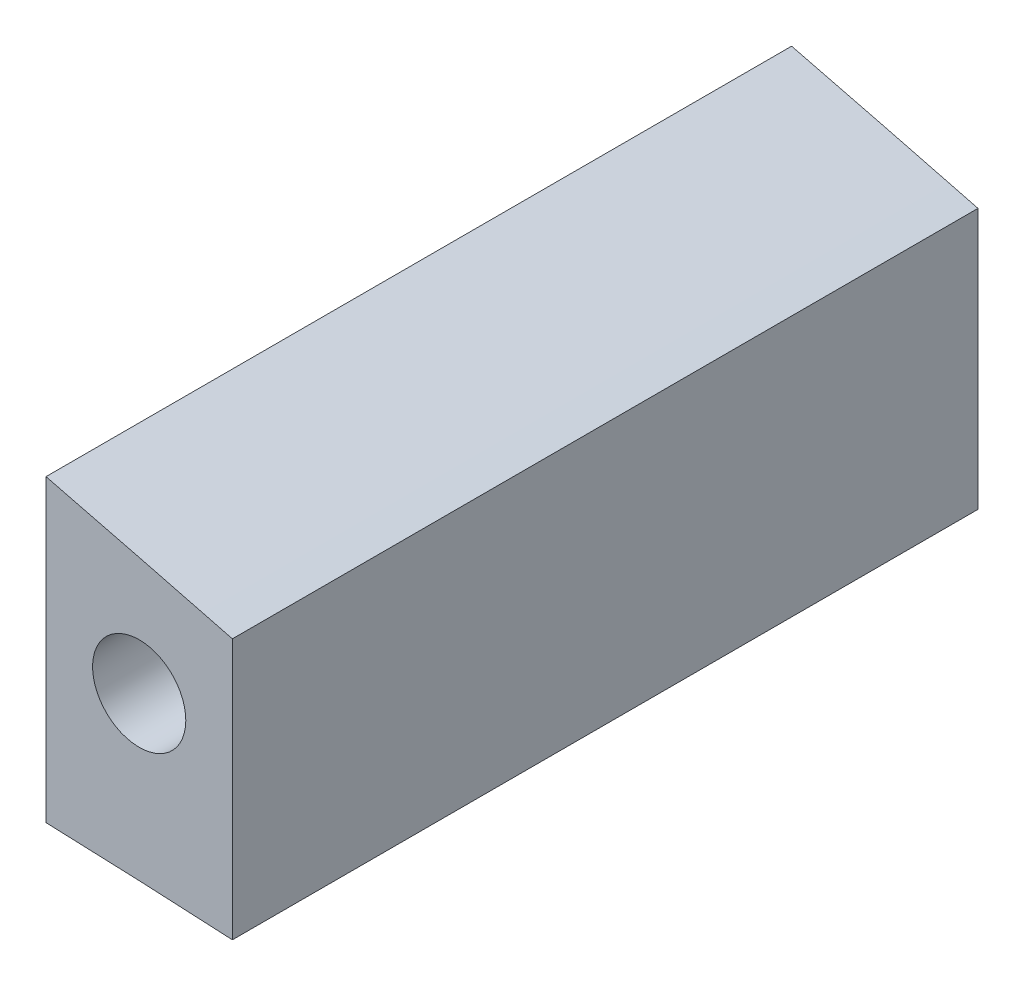
ISO-10303-21;
HEADER;
FILE_DESCRIPTION(('STEP AP214'),'2;1');
FILE_NAME('part.step','',(''),(''),'','','');
FILE_SCHEMA(('AUTOMOTIVE_DESIGN { 1 0 10303 214 1 1 1 1 }'));
ENDSEC;
DATA;
#1=APPLICATION_CONTEXT('core data for automotive mechanical design processes');
#2=APPLICATION_PROTOCOL_DEFINITION('international standard','automotive_design',2000,#1);
#3=PRODUCT_CONTEXT('',#1,'mechanical');
#4=PRODUCT('Part','Part','',(#3));
#5=PRODUCT_RELATED_PRODUCT_CATEGORY('part','',(#4));
#6=PRODUCT_DEFINITION_FORMATION('','',#4);
#7=PRODUCT_DEFINITION_CONTEXT('part definition',#1,'design');
#8=PRODUCT_DEFINITION('design','',#6,#7);
#9=PRODUCT_DEFINITION_SHAPE('','',#8);
#10=(LENGTH_UNIT() NAMED_UNIT(*) SI_UNIT(.MILLI.,.METRE.));
#11=(NAMED_UNIT(*) PLANE_ANGLE_UNIT() SI_UNIT($,.RADIAN.));
#12=(NAMED_UNIT(*) SI_UNIT($,.STERADIAN.) SOLID_ANGLE_UNIT());
#13=UNCERTAINTY_MEASURE_WITH_UNIT(LENGTH_MEASURE(1.E-05),#10,'distance_accuracy_value','');
#14=(GEOMETRIC_REPRESENTATION_CONTEXT(3) GLOBAL_UNCERTAINTY_ASSIGNED_CONTEXT((#13)) GLOBAL_UNIT_ASSIGNED_CONTEXT((#10,
#11,#12)) REPRESENTATION_CONTEXT('',''));
#15=CARTESIAN_POINT('',(0.,0.,0.));
#16=DIRECTION('',(0.,0.,1.));
#17=DIRECTION('',(1.,0.,0.));
#18=AXIS2_PLACEMENT_3D('',#15,#16,#17);
#19=CARTESIAN_POINT('',(0.000560351162113587,0.000130087070423624,50.8));
#20=CARTESIAN_POINT('',(1.23071418869678,-6.92407609127206,50.8));
#21=CARTESIAN_POINT('',(15.3166033306834,-6.18906584099094,50.8));
#22=CARTESIAN_POINT('',(36.4546728163185,-6.09849990105009,50.8));
#23=CARTESIAN_POINT('',(66.5061971849192,-0.586669106973501,50.8));
#24=CARTESIAN_POINT('',(110.497331171581,6.18149522271792,50.8));
#25=CARTESIAN_POINT('',(157.718638091679,9.03065014873911,50.8));
#26=CARTESIAN_POINT('',(205.10142463584,8.83808028186313,50.8));
#27=CARTESIAN_POINT('',(235.858814759408,7.87030619247826,50.8));
#28=CARTESIAN_POINT('',(260.846344817159,5.42741339404395,50.8));
#29=CARTESIAN_POINT('',(276.264022989737,4.51435670375389,50.8));
#30=CARTESIAN_POINT('',(293.989507544058,2.09398731346533,50.8));
#31=CARTESIAN_POINT('',(303.956832564589,1.47095520994628,50.8));
#32=CARTESIAN_POINT('',(309.846313894505,0.000130087070423666,50.8));
#33=B_SPLINE_CURVE_WITH_KNOTS('',3,(#19,#20,#21,#22,#23,#24,#25,#26,#27,#28,#29,#30,#31,#32),
.UNSPECIFIED.,.F.,.F.,(4,1,1,1,1,1,1,1,1,1,1,4),(0.,0.0569078595717698,0.106482711504673,
0.214488052979465,0.341297688349143,0.535095665520157,0.664680853556909,0.794660698192775,
0.828978881532905,0.904725108725214,0.942212919019968,1.),.UNSPECIFIED.);
#34=DIRECTION('',(0.,0.,-1.));
#35=VECTOR('',#34,1.);
#36=SURFACE_OF_LINEAR_EXTRUSION('',#33,#35);
#37=CARTESIAN_POINT('',(220.946313894505,8.25519881438191,50.8));
#38=VERTEX_POINT('',#37);
#39=CARTESIAN_POINT('',(233.646313894505,7.69052977146896,50.8));
#40=VERTEX_POINT('',#39);
#41=EDGE_CURVE('E92',#38,#40,#33,.T.);
#42=ORIENTED_EDGE('',*,*,#41,.F.);
#43=DIRECTION('',(0.,0.,-1.));
#44=VECTOR('',#43,1.);
#45=CARTESIAN_POINT('',(220.946313894505,8.25519881439546,50.8));
#46=LINE('',#45,#44);
#47=CARTESIAN_POINT('',(220.946313894505,8.2551988143819,0.));
#48=VERTEX_POINT('',#47);
#49=EDGE_CURVE('E79',#38,#48,#46,.T.);
#50=ORIENTED_EDGE('',*,*,#49,.T.);
#51=CARTESIAN_POINT('',(0.000560351162113587,0.000130087070423624,0.));
#52=CARTESIAN_POINT('',(1.23071418869678,-6.92407609127206,0.));
#53=CARTESIAN_POINT('',(15.3166033306834,-6.18906584099094,0.));
#54=CARTESIAN_POINT('',(36.4546728163185,-6.09849990105009,0.));
#55=CARTESIAN_POINT('',(66.5061971849192,-0.586669106973501,0.));
#56=CARTESIAN_POINT('',(110.497331171581,6.18149522271792,0.));
#57=CARTESIAN_POINT('',(157.718638091679,9.03065014873911,0.));
#58=CARTESIAN_POINT('',(205.10142463584,8.83808028186313,0.));
#59=CARTESIAN_POINT('',(235.858814759408,7.87030619247826,0.));
#60=CARTESIAN_POINT('',(260.846344817159,5.42741339404395,0.));
#61=CARTESIAN_POINT('',(276.264022989737,4.51435670375389,0.));
#62=CARTESIAN_POINT('',(293.989507544058,2.09398731346533,0.));
#63=CARTESIAN_POINT('',(303.956832564589,1.47095520994628,0.));
#64=CARTESIAN_POINT('',(309.846313894505,0.000130087070423666,0.));
#65=B_SPLINE_CURVE_WITH_KNOTS('',3,(#51,#52,#53,#54,#55,#56,#57,#58,#59,#60,#61,#62,#63,#64),
.UNSPECIFIED.,.F.,.F.,(4,1,1,1,1,1,1,1,1,1,1,4),(0.,0.0569078595717698,0.106482711504673,
0.214488052979465,0.341297688349143,0.535095665520157,0.664680853556909,0.794660698192775,
0.828978881532905,0.904725108725214,0.942212919019968,1.),.UNSPECIFIED.);
#66=CARTESIAN_POINT('',(233.646313884782,7.69052977146896,0.));
#67=VERTEX_POINT('',#66);
#68=EDGE_CURVE('E62',#48,#67,#65,.T.);
#69=ORIENTED_EDGE('',*,*,#68,.T.);
#70=DIRECTION('',(0.,0.,-1.));
#71=VECTOR('',#70,1.);
#72=CARTESIAN_POINT('',(233.646313894505,7.69052977092525,50.8));
#73=LINE('',#72,#71);
#74=EDGE_CURVE('E97',#40,#67,#73,.T.);
#75=ORIENTED_EDGE('',*,*,#74,.F.);
#76=EDGE_LOOP('',(#42,#50,#69,#75));
#77=FACE_BOUND('',#76,.T.);
#78=ADVANCED_FACE('F38',(#77),#36,.F.);
#79=CARTESIAN_POINT('',(309.846313894505,0.000130087070423864,50.8));
#80=CARTESIAN_POINT('',(314.816918223261,-0.51620674157964,50.8));
#81=CARTESIAN_POINT('',(301.273197720551,4.38282813873556,50.8));
#82=CARTESIAN_POINT('',(290.359837670022,8.71099439045776,50.8));
#83=CARTESIAN_POINT('',(256.952064400645,19.5289209482833,50.8));
#84=CARTESIAN_POINT('',(217.961060472083,29.6129748944238,50.8));
#85=CARTESIAN_POINT('',(173.256699242147,40.0411042779434,50.8));
#86=CARTESIAN_POINT('',(131.400792108858,47.8848319151037,50.8));
#87=CARTESIAN_POINT('',(89.5976184754884,49.290763053775,50.8));
#88=CARTESIAN_POINT('',(52.1111282710831,42.0692152748914,50.8));
#89=CARTESIAN_POINT('',(26.2867198183782,29.9751763284633,50.8));
#90=CARTESIAN_POINT('',(8.64909202481883,17.8566051741579,50.8));
#91=CARTESIAN_POINT('',(0.810633126632263,7.35919605469637,50.8));
#92=CARTESIAN_POINT('',(0.000560351162116727,0.000130087070423829,50.8));
#93=B_SPLINE_CURVE_WITH_KNOTS('',3,(#79,#80,#81,#82,#83,#84,#85,#86,#87,#88,#89,#90,#91,#92),
.UNSPECIFIED.,.F.,.F.,(4,1,1,1,1,1,1,1,1,1,1,4),(0.,0.0239417713693992,0.070244030177139,
0.147561721425381,0.308455887006792,0.442387865106874,0.551517565626309,0.687091076796298,
0.811391258419108,0.886311735305172,0.939136382225768,1.),.UNSPECIFIED.);
#94=DIRECTION('',(0.,0.,-1.));
#95=VECTOR('',#94,1.);
#96=SURFACE_OF_LINEAR_EXTRUSION('',#93,#95);
#97=CARTESIAN_POINT('',(309.846313894505,0.000130087070423864,0.));
#98=CARTESIAN_POINT('',(314.816918223261,-0.51620674157964,0.));
#99=CARTESIAN_POINT('',(301.273197720551,4.38282813873556,0.));
#100=CARTESIAN_POINT('',(290.359837670022,8.71099439045776,0.));
#101=CARTESIAN_POINT('',(256.952064400645,19.5289209482833,0.));
#102=CARTESIAN_POINT('',(217.961060472083,29.6129748944238,0.));
#103=CARTESIAN_POINT('',(173.256699242147,40.0411042779434,0.));
#104=CARTESIAN_POINT('',(131.400792108858,47.8848319151037,0.));
#105=CARTESIAN_POINT('',(89.5976184754884,49.290763053775,0.));
#106=CARTESIAN_POINT('',(52.1111282710831,42.0692152748914,0.));
#107=CARTESIAN_POINT('',(26.2867198183782,29.9751763284633,0.));
#108=CARTESIAN_POINT('',(8.64909202481883,17.8566051741579,0.));
#109=CARTESIAN_POINT('',(0.810633126632263,7.35919605469637,0.));
#110=CARTESIAN_POINT('',(0.000560351162116727,0.000130087070423829,0.));
#111=B_SPLINE_CURVE_WITH_KNOTS('',3,(#97,#98,#99,#100,#101,#102,#103,#104,#105,#106,#107,#108,
#109,#110),.UNSPECIFIED.,.F.,.F.,(4,1,1,1,1,1,1,1,1,1,1,4),(0.,0.0239417713693992,
0.070244030177139,0.147561721425381,0.308455887006792,0.442387865106874,0.551517565626309,
0.687091076796298,0.811391258419108,0.886311735305172,0.939136382225768,1.),.UNSPECIFIED.);
#112=CARTESIAN_POINT('',(233.646313894505,25.4527523915985,0.));
#113=VERTEX_POINT('',#112);
#114=CARTESIAN_POINT('',(220.946313894505,28.6725157585964,0.));
#115=VERTEX_POINT('',#114);
#116=EDGE_CURVE('E99',#113,#115,#111,.T.);
#117=ORIENTED_EDGE('',*,*,#116,.T.);
#118=DIRECTION('',(0.,0.,-1.));
#119=VECTOR('',#118,1.);
#120=CARTESIAN_POINT('',(220.946313894505,28.6725157585964,50.8));
#121=LINE('',#120,#119);
#122=CARTESIAN_POINT('',(220.946313894505,28.6725157585964,50.8));
#123=VERTEX_POINT('',#122);
#124=EDGE_CURVE('E54',#115,#123,#121,.F.);
#125=ORIENTED_EDGE('',*,*,#124,.T.);
#126=CARTESIAN_POINT('',(233.646313894505,25.4527523915985,50.8));
#127=VERTEX_POINT('',#126);
#128=EDGE_CURVE('E47',#127,#123,#93,.T.);
#129=ORIENTED_EDGE('',*,*,#128,.F.);
#130=DIRECTION('',(0.,0.,-1.));
#131=VECTOR('',#130,1.);
#132=CARTESIAN_POINT('',(233.646313894505,25.4527523940641,50.8));
#133=LINE('',#132,#131);
#134=EDGE_CURVE('E187',#113,#127,#133,.F.);
#135=ORIENTED_EDGE('',*,*,#134,.F.);
#136=EDGE_LOOP('',(#117,#125,#129,#135));
#137=FACE_BOUND('',#136,.T.);
#138=ADVANCED_FACE('F122',(#137),#96,.F.);
#139=CARTESIAN_POINT('',(153.387816973495,8.33338198857885,50.8));
#140=DIRECTION('',(0.,0.,-1.));
#141=DIRECTION('',(-1.,0.,0.));
#142=AXIS2_PLACEMENT_3D('',#139,#140,#141);
#143=PLANE('',#142);
#144=CARTESIAN_POINT('',(227.296313894505,19.0501300870704,50.8));
#145=DIRECTION('',(0.,0.,1.));
#146=DIRECTION('',(1.,0.,0.));
#147=AXIS2_PLACEMENT_3D('',#144,#145,#146);
#148=CIRCLE('',#147,3.175);
#149=CARTESIAN_POINT('',(230.471313894505,19.0501300870704,50.8));
#150=VERTEX_POINT('',#149);
#151=EDGE_CURVE('E108',#150,#150,#148,.T.);
#152=ORIENTED_EDGE('',*,*,#151,.F.);
#153=EDGE_LOOP('',(#152));
#154=FACE_BOUND('',#153,.T.);
#155=ORIENTED_EDGE('',*,*,#128,.T.);
#156=DIRECTION('',(0.,1.,0.));
#157=VECTOR('',#156,1.);
#158=CARTESIAN_POINT('',(220.946313894505,-24.2165503945353,50.8));
#159=LINE('',#158,#157);
#160=EDGE_CURVE('E82',#38,#123,#159,.T.);
#161=ORIENTED_EDGE('',*,*,#160,.F.);
#162=ORIENTED_EDGE('',*,*,#41,.T.);
#163=DIRECTION('',(0.,1.,0.));
#164=VECTOR('',#163,1.);
#165=CARTESIAN_POINT('',(233.646313894505,-6.34986991292955,50.8));
#166=LINE('',#165,#164);
#167=EDGE_CURVE('E86',#40,#127,#166,.T.);
#168=ORIENTED_EDGE('',*,*,#167,.T.);
#169=EDGE_LOOP('',(#155,#161,#162,#168));
#170=FACE_BOUND('',#169,.T.);
#171=ADVANCED_FACE('F90',(#154,#170),#143,.F.);
#172=CARTESIAN_POINT('',(153.387816973495,8.33338198857885,0.));
#173=DIRECTION('',(0.,0.,-1.));
#174=DIRECTION('',(-1.,0.,0.));
#175=AXIS2_PLACEMENT_3D('',#172,#173,#174);
#176=PLANE('',#175);
#177=DIRECTION('',(0.,1.,0.));
#178=VECTOR('',#177,1.);
#179=CARTESIAN_POINT('',(220.946313894505,-24.2165503945353,0.));
#180=LINE('',#179,#178);
#181=EDGE_CURVE('E83',#48,#115,#180,.T.);
#182=ORIENTED_EDGE('',*,*,#181,.T.);
#183=ORIENTED_EDGE('',*,*,#116,.F.);
#184=DIRECTION('',(0.,-1.,0.));
#185=VECTOR('',#184,1.);
#186=CARTESIAN_POINT('',(233.646313894505,8.33338198857885,0.));
#187=LINE('',#186,#185);
#188=EDGE_CURVE('E11',#113,#67,#187,.T.);
#189=ORIENTED_EDGE('',*,*,#188,.T.);
#190=ORIENTED_EDGE('',*,*,#68,.F.);
#191=EDGE_LOOP('',(#182,#183,#189,#190));
#192=FACE_BOUND('',#191,.T.);
#193=CARTESIAN_POINT('',(227.296313894505,19.0501300870704,0.));
#194=DIRECTION('',(0.,0.,1.));
#195=DIRECTION('',(1.,0.,0.));
#196=AXIS2_PLACEMENT_3D('',#193,#194,#195);
#197=CIRCLE('',#196,3.175);
#198=CARTESIAN_POINT('',(230.471313894505,19.0501300870704,0.));
#199=VERTEX_POINT('',#198);
#200=EDGE_CURVE('E195',#199,#199,#197,.T.);
#201=ORIENTED_EDGE('',*,*,#200,.T.);
#202=EDGE_LOOP('',(#201));
#203=FACE_BOUND('',#202,.T.);
#204=ADVANCED_FACE('F126',(#192,#203),#176,.T.);
#205=CARTESIAN_POINT('',(227.296313894505,19.0501300870704,0.));
#206=DIRECTION('',(0.,0.,1.));
#207=DIRECTION('',(1.,0.,0.));
#208=AXIS2_PLACEMENT_3D('',#205,#206,#207);
#209=CYLINDRICAL_SURFACE('',#208,3.175);
#210=ORIENTED_EDGE('',*,*,#200,.F.);
#211=EDGE_LOOP('',(#210));
#212=FACE_BOUND('',#211,.T.);
#213=ORIENTED_EDGE('',*,*,#151,.T.);
#214=EDGE_LOOP('',(#213));
#215=FACE_BOUND('',#214,.T.);
#216=ADVANCED_FACE('F129',(#212,#215),#209,.F.);
#217=CARTESIAN_POINT('',(233.646313894505,-6.34986991292955,0.));
#218=DIRECTION('',(1.,0.,0.));
#219=DIRECTION('',(0.,0.,-1.));
#220=AXIS2_PLACEMENT_3D('',#217,#218,#219);
#221=PLANE('',#220);
#222=ORIENTED_EDGE('',*,*,#74,.T.);
#223=ORIENTED_EDGE('',*,*,#188,.F.);
#224=ORIENTED_EDGE('',*,*,#134,.T.);
#225=ORIENTED_EDGE('',*,*,#167,.F.);
#226=EDGE_LOOP('',(#222,#223,#224,#225));
#227=FACE_BOUND('',#226,.T.);
#228=ADVANCED_FACE('F136',(#227),#221,.T.);
#229=CARTESIAN_POINT('',(220.946313894505,-24.2165503945353,0.));
#230=DIRECTION('',(1.,0.,0.));
#231=DIRECTION('',(0.,1.,0.));
#232=AXIS2_PLACEMENT_3D('',#229,#230,#231);
#233=PLANE('',#232);
#234=ORIENTED_EDGE('',*,*,#160,.T.);
#235=ORIENTED_EDGE('',*,*,#124,.F.);
#236=ORIENTED_EDGE('',*,*,#181,.F.);
#237=ORIENTED_EDGE('',*,*,#49,.F.);
#238=EDGE_LOOP('',(#234,#235,#236,#237));
#239=FACE_BOUND('',#238,.T.);
#240=ADVANCED_FACE('F81',(#239),#233,.F.);
#241=CLOSED_SHELL('',(#78,#138,#171,#204,#216,#228,#240));
#242=MANIFOLD_SOLID_BREP('B2',#241);
#243=ADVANCED_BREP_SHAPE_REPRESENTATION('',(#18,#242),#14);
#244=SHAPE_DEFINITION_REPRESENTATION(#9,#243);
ENDSEC;
END-ISO-10303-21;
